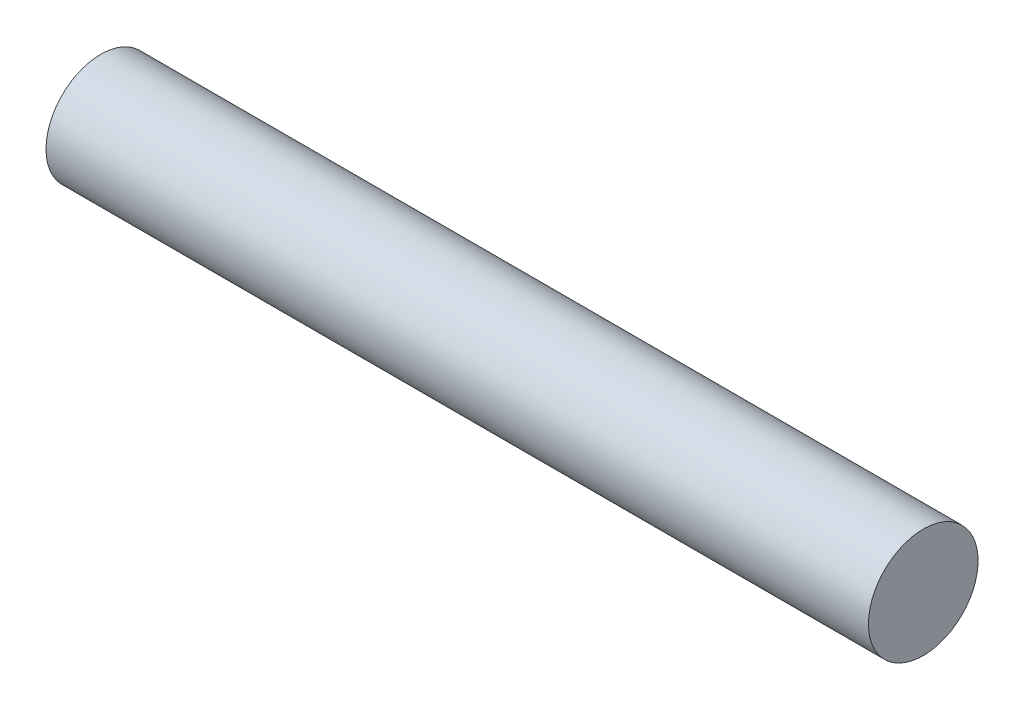
ISO-10303-21;
HEADER;
FILE_DESCRIPTION(('STEP AP214'),'2;1');
FILE_NAME('part.step','',(''),(''),'','','');
FILE_SCHEMA(('AUTOMOTIVE_DESIGN { 1 0 10303 214 1 1 1 1 }'));
ENDSEC;
DATA;
#1=APPLICATION_CONTEXT('core data for automotive mechanical design processes');
#2=APPLICATION_PROTOCOL_DEFINITION('international standard','automotive_design',2000,#1);
#3=PRODUCT_CONTEXT('',#1,'mechanical');
#4=PRODUCT('Part','Part','',(#3));
#5=PRODUCT_RELATED_PRODUCT_CATEGORY('part','',(#4));
#6=PRODUCT_DEFINITION_FORMATION('','',#4);
#7=PRODUCT_DEFINITION_CONTEXT('part definition',#1,'design');
#8=PRODUCT_DEFINITION('design','',#6,#7);
#9=PRODUCT_DEFINITION_SHAPE('','',#8);
#10=(LENGTH_UNIT() NAMED_UNIT(*) SI_UNIT(.MILLI.,.METRE.));
#11=(NAMED_UNIT(*) PLANE_ANGLE_UNIT() SI_UNIT($,.RADIAN.));
#12=(NAMED_UNIT(*) SI_UNIT($,.STERADIAN.) SOLID_ANGLE_UNIT());
#13=UNCERTAINTY_MEASURE_WITH_UNIT(LENGTH_MEASURE(1.E-05),#10,'distance_accuracy_value','');
#14=(GEOMETRIC_REPRESENTATION_CONTEXT(3) GLOBAL_UNCERTAINTY_ASSIGNED_CONTEXT((#13)) GLOBAL_UNIT_ASSIGNED_CONTEXT((#10,
#11,#12)) REPRESENTATION_CONTEXT('',''));
#15=CARTESIAN_POINT('',(0.,0.,0.));
#16=DIRECTION('',(0.,0.,1.));
#17=DIRECTION('',(1.,0.,0.));
#18=AXIS2_PLACEMENT_3D('',#15,#16,#17);
#19=CARTESIAN_POINT('',(120.,0.,0.));
#20=DIRECTION('',(-1.,0.,0.));
#21=DIRECTION('',(0.,0.,1.));
#22=AXIS2_PLACEMENT_3D('',#19,#20,#21);
#23=PLANE('',#22);
#24=CARTESIAN_POINT('',(120.,0.,0.));
#25=DIRECTION('',(-1.,0.,0.));
#26=DIRECTION('',(0.,0.,1.));
#27=AXIS2_PLACEMENT_3D('',#24,#25,#26);
#28=CIRCLE('',#27,8.);
#29=CARTESIAN_POINT('',(120.,0.,8.));
#30=VERTEX_POINT('',#29);
#31=EDGE_CURVE('E10',#30,#30,#28,.T.);
#32=ORIENTED_EDGE('',*,*,#31,.F.);
#33=EDGE_LOOP('',(#32));
#34=FACE_BOUND('',#33,.T.);
#35=ADVANCED_FACE('F37',(#34),#23,.F.);
#36=CARTESIAN_POINT('',(-0.5,0.,0.));
#37=DIRECTION('',(-1.,0.,0.));
#38=DIRECTION('',(0.,0.,1.));
#39=AXIS2_PLACEMENT_3D('',#36,#37,#38);
#40=CYLINDRICAL_SURFACE('',#39,8.);
#41=CARTESIAN_POINT('',(0.,0.,0.));
#42=DIRECTION('',(-1.,0.,0.));
#43=DIRECTION('',(0.,0.,1.));
#44=AXIS2_PLACEMENT_3D('',#41,#42,#43);
#45=CIRCLE('',#44,8.);
#46=CARTESIAN_POINT('',(0.,0.,8.));
#47=VERTEX_POINT('',#46);
#48=EDGE_CURVE('E43',#47,#47,#45,.T.);
#49=ORIENTED_EDGE('',*,*,#48,.F.);
#50=EDGE_LOOP('',(#49));
#51=FACE_BOUND('',#50,.T.);
#52=ORIENTED_EDGE('',*,*,#31,.T.);
#53=EDGE_LOOP('',(#52));
#54=FACE_BOUND('',#53,.T.);
#55=ADVANCED_FACE('F51',(#51,#54),#40,.T.);
#56=CARTESIAN_POINT('',(0.,8.,0.));
#57=DIRECTION('',(1.,0.,0.));
#58=DIRECTION('',(0.,0.,-1.));
#59=AXIS2_PLACEMENT_3D('',#56,#57,#58);
#60=PLANE('',#59);
#61=ORIENTED_EDGE('',*,*,#48,.T.);
#62=EDGE_LOOP('',(#61));
#63=FACE_BOUND('',#62,.T.);
#64=ADVANCED_FACE('F49',(#63),#60,.F.);
#65=CLOSED_SHELL('',(#35,#55,#64));
#66=MANIFOLD_SOLID_BREP('B2',#65);
#67=ADVANCED_BREP_SHAPE_REPRESENTATION('',(#18,#66),#14);
#68=SHAPE_DEFINITION_REPRESENTATION(#9,#67);
ENDSEC;
END-ISO-10303-21;
